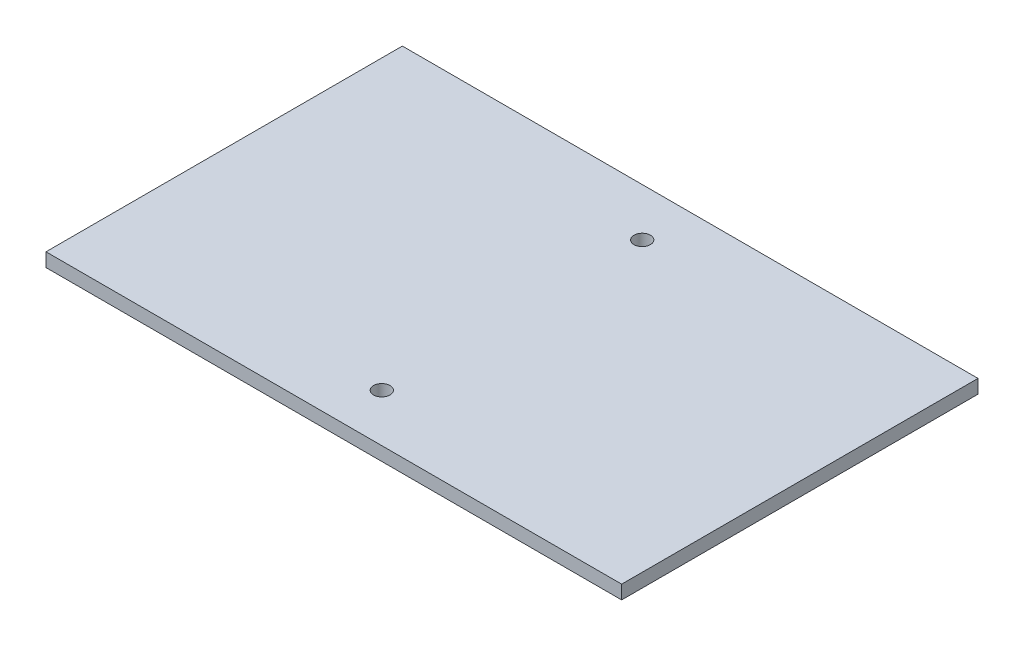
ISO-10303-21;
HEADER;
FILE_DESCRIPTION(('STEP AP214'),'2;1');
FILE_NAME('part.step','',(''),(''),'','','');
FILE_SCHEMA(('AUTOMOTIVE_DESIGN { 1 0 10303 214 1 1 1 1 }'));
ENDSEC;
DATA;
#1=APPLICATION_CONTEXT('core data for automotive mechanical design processes');
#2=APPLICATION_PROTOCOL_DEFINITION('international standard','automotive_design',2000,#1);
#3=PRODUCT_CONTEXT('',#1,'mechanical');
#4=PRODUCT('Part','Part','',(#3));
#5=PRODUCT_RELATED_PRODUCT_CATEGORY('part','',(#4));
#6=PRODUCT_DEFINITION_FORMATION('','',#4);
#7=PRODUCT_DEFINITION_CONTEXT('part definition',#1,'design');
#8=PRODUCT_DEFINITION('design','',#6,#7);
#9=PRODUCT_DEFINITION_SHAPE('','',#8);
#10=(LENGTH_UNIT() NAMED_UNIT(*) SI_UNIT(.MILLI.,.METRE.));
#11=(NAMED_UNIT(*) PLANE_ANGLE_UNIT() SI_UNIT($,.RADIAN.));
#12=(NAMED_UNIT(*) SI_UNIT($,.STERADIAN.) SOLID_ANGLE_UNIT());
#13=UNCERTAINTY_MEASURE_WITH_UNIT(LENGTH_MEASURE(1.E-05),#10,'distance_accuracy_value','');
#14=(GEOMETRIC_REPRESENTATION_CONTEXT(3) GLOBAL_UNCERTAINTY_ASSIGNED_CONTEXT((#13)) GLOBAL_UNIT_ASSIGNED_CONTEXT((#10,
#11,#12)) REPRESENTATION_CONTEXT('',''));
#15=CARTESIAN_POINT('',(0.,0.,0.));
#16=DIRECTION('',(0.,0.,1.));
#17=DIRECTION('',(1.,0.,0.));
#18=AXIS2_PLACEMENT_3D('',#15,#16,#17);
#19=CARTESIAN_POINT('',(105.,5.,-60.));
#20=DIRECTION('',(-1.,0.,0.));
#21=DIRECTION('',(0.,0.,1.));
#22=AXIS2_PLACEMENT_3D('',#19,#20,#21);
#23=PLANE('',#22);
#24=DIRECTION('',(0.,0.,-1.));
#25=VECTOR('',#24,1.);
#26=CARTESIAN_POINT('',(105.,0.,-60.));
#27=LINE('',#26,#25);
#28=CARTESIAN_POINT('',(105.,0.,65.));
#29=VERTEX_POINT('',#28);
#30=CARTESIAN_POINT('',(105.,0.,-65.));
#31=VERTEX_POINT('',#30);
#32=EDGE_CURVE('E83',#29,#31,#27,.T.);
#33=ORIENTED_EDGE('',*,*,#32,.T.);
#34=DIRECTION('',(0.,-1.,0.));
#35=VECTOR('',#34,1.);
#36=CARTESIAN_POINT('',(105.,5.,-65.));
#37=LINE('',#36,#35);
#38=CARTESIAN_POINT('',(105.,5.,-65.));
#39=VERTEX_POINT('',#38);
#40=EDGE_CURVE('E86',#39,#31,#37,.T.);
#41=ORIENTED_EDGE('',*,*,#40,.F.);
#42=DIRECTION('',(0.,0.,-1.));
#43=VECTOR('',#42,1.);
#44=CARTESIAN_POINT('',(105.,5.,-60.));
#45=LINE('',#44,#43);
#46=CARTESIAN_POINT('',(105.,5.,65.));
#47=VERTEX_POINT('',#46);
#48=EDGE_CURVE('E53',#47,#39,#45,.T.);
#49=ORIENTED_EDGE('',*,*,#48,.F.);
#50=DIRECTION('',(0.,1.,0.));
#51=VECTOR('',#50,1.);
#52=CARTESIAN_POINT('',(105.,0.,65.));
#53=LINE('',#52,#51);
#54=EDGE_CURVE('E87',#29,#47,#53,.T.);
#55=ORIENTED_EDGE('',*,*,#54,.F.);
#56=EDGE_LOOP('',(#33,#41,#49,#55));
#57=FACE_BOUND('',#56,.T.);
#58=ADVANCED_FACE('F44',(#57),#23,.F.);
#59=CARTESIAN_POINT('',(-105.,5.,-60.));
#60=DIRECTION('',(1.,0.,0.));
#61=DIRECTION('',(0.,0.,-1.));
#62=AXIS2_PLACEMENT_3D('',#59,#60,#61);
#63=PLANE('',#62);
#64=DIRECTION('',(0.,0.,1.));
#65=VECTOR('',#64,1.);
#66=CARTESIAN_POINT('',(-105.,0.,-60.));
#67=LINE('',#66,#65);
#68=CARTESIAN_POINT('',(-105.,0.,-65.));
#69=VERTEX_POINT('',#68);
#70=CARTESIAN_POINT('',(-105.,0.,65.));
#71=VERTEX_POINT('',#70);
#72=EDGE_CURVE('E92',#69,#71,#67,.T.);
#73=ORIENTED_EDGE('',*,*,#72,.T.);
#74=DIRECTION('',(0.,-1.,0.));
#75=VECTOR('',#74,1.);
#76=CARTESIAN_POINT('',(-105.,5.,65.));
#77=LINE('',#76,#75);
#78=CARTESIAN_POINT('',(-105.,5.,65.));
#79=VERTEX_POINT('',#78);
#80=EDGE_CURVE('E115',#79,#71,#77,.T.);
#81=ORIENTED_EDGE('',*,*,#80,.F.);
#82=DIRECTION('',(0.,0.,1.));
#83=VECTOR('',#82,1.);
#84=CARTESIAN_POINT('',(-105.,5.,-60.));
#85=LINE('',#84,#83);
#86=CARTESIAN_POINT('',(-105.,5.,-65.));
#87=VERTEX_POINT('',#86);
#88=EDGE_CURVE('E11',#87,#79,#85,.T.);
#89=ORIENTED_EDGE('',*,*,#88,.F.);
#90=DIRECTION('',(0.,1.,0.));
#91=VECTOR('',#90,1.);
#92=CARTESIAN_POINT('',(-105.,0.,-65.));
#93=LINE('',#92,#91);
#94=EDGE_CURVE('E101',#69,#87,#93,.T.);
#95=ORIENTED_EDGE('',*,*,#94,.F.);
#96=EDGE_LOOP('',(#73,#81,#89,#95));
#97=FACE_BOUND('',#96,.T.);
#98=ADVANCED_FACE('F161',(#97),#63,.F.);
#99=CARTESIAN_POINT('',(0.,5.,0.));
#100=DIRECTION('',(0.,1.,0.));
#101=DIRECTION('',(0.,0.,1.));
#102=AXIS2_PLACEMENT_3D('',#99,#100,#101);
#103=PLANE('',#102);
#104=CARTESIAN_POINT('',(0.,5.,-47.5));
#105=DIRECTION('',(0.,1.,0.));
#106=DIRECTION('',(0.,0.,1.));
#107=AXIS2_PLACEMENT_3D('',#104,#105,#106);
#108=CIRCLE('',#107,3.);
#109=CARTESIAN_POINT('',(0.,5.,-44.5));
#110=VERTEX_POINT('',#109);
#111=EDGE_CURVE('E128',#110,#110,#108,.T.);
#112=ORIENTED_EDGE('',*,*,#111,.F.);
#113=EDGE_LOOP('',(#112));
#114=FACE_BOUND('',#113,.T.);
#115=CARTESIAN_POINT('',(0.,5.,47.5));
#116=DIRECTION('',(0.,1.,0.));
#117=DIRECTION('',(0.,0.,1.));
#118=AXIS2_PLACEMENT_3D('',#115,#116,#117);
#119=CIRCLE('',#118,3.);
#120=CARTESIAN_POINT('',(0.,5.,50.5));
#121=VERTEX_POINT('',#120);
#122=EDGE_CURVE('E127',#121,#121,#119,.T.);
#123=ORIENTED_EDGE('',*,*,#122,.F.);
#124=EDGE_LOOP('',(#123));
#125=FACE_BOUND('',#124,.T.);
#126=ORIENTED_EDGE('',*,*,#48,.T.);
#127=DIRECTION('',(1.,0.,0.));
#128=VECTOR('',#127,1.);
#129=CARTESIAN_POINT('',(-105.,5.,-65.));
#130=LINE('',#129,#128);
#131=EDGE_CURVE('E105',#87,#39,#130,.T.);
#132=ORIENTED_EDGE('',*,*,#131,.F.);
#133=ORIENTED_EDGE('',*,*,#88,.T.);
#134=DIRECTION('',(-1.,0.,0.));
#135=VECTOR('',#134,1.);
#136=CARTESIAN_POINT('',(105.,5.,65.));
#137=LINE('',#136,#135);
#138=EDGE_CURVE('E124',#47,#79,#137,.T.);
#139=ORIENTED_EDGE('',*,*,#138,.F.);
#140=EDGE_LOOP('',(#126,#132,#133,#139));
#141=FACE_BOUND('',#140,.T.);
#142=ADVANCED_FACE('F165',(#114,#125,#141),#103,.T.);
#143=CARTESIAN_POINT('',(0.,0.,0.));
#144=DIRECTION('',(0.,1.,0.));
#145=DIRECTION('',(0.,0.,1.));
#146=AXIS2_PLACEMENT_3D('',#143,#144,#145);
#147=PLANE('',#146);
#148=CARTESIAN_POINT('',(0.,0.,-47.5));
#149=DIRECTION('',(0.,1.,0.));
#150=DIRECTION('',(0.,0.,1.));
#151=AXIS2_PLACEMENT_3D('',#148,#149,#150);
#152=CIRCLE('',#151,3.);
#153=CARTESIAN_POINT('',(0.,0.,-44.5));
#154=VERTEX_POINT('',#153);
#155=EDGE_CURVE('E47',#154,#154,#152,.T.);
#156=ORIENTED_EDGE('',*,*,#155,.T.);
#157=EDGE_LOOP('',(#156));
#158=FACE_BOUND('',#157,.T.);
#159=CARTESIAN_POINT('',(0.,0.,47.5));
#160=DIRECTION('',(0.,1.,0.));
#161=DIRECTION('',(0.,0.,1.));
#162=AXIS2_PLACEMENT_3D('',#159,#160,#161);
#163=CIRCLE('',#162,3.);
#164=CARTESIAN_POINT('',(0.,0.,50.5));
#165=VERTEX_POINT('',#164);
#166=EDGE_CURVE('E131',#165,#165,#163,.T.);
#167=ORIENTED_EDGE('',*,*,#166,.T.);
#168=EDGE_LOOP('',(#167));
#169=FACE_BOUND('',#168,.T.);
#170=ORIENTED_EDGE('',*,*,#32,.F.);
#171=DIRECTION('',(1.,0.,0.));
#172=VECTOR('',#171,1.);
#173=CARTESIAN_POINT('',(-105.,0.,65.));
#174=LINE('',#173,#172);
#175=EDGE_CURVE('E119',#71,#29,#174,.T.);
#176=ORIENTED_EDGE('',*,*,#175,.F.);
#177=ORIENTED_EDGE('',*,*,#72,.F.);
#178=DIRECTION('',(-1.,0.,0.));
#179=VECTOR('',#178,1.);
#180=CARTESIAN_POINT('',(105.,0.,-65.));
#181=LINE('',#180,#179);
#182=EDGE_CURVE('E95',#31,#69,#181,.T.);
#183=ORIENTED_EDGE('',*,*,#182,.F.);
#184=EDGE_LOOP('',(#170,#176,#177,#183));
#185=FACE_BOUND('',#184,.T.);
#186=ADVANCED_FACE('F96',(#158,#169,#185),#147,.F.);
#187=CARTESIAN_POINT('',(0.,-5.,47.5));
#188=DIRECTION('',(0.,1.,0.));
#189=DIRECTION('',(0.,0.,1.));
#190=AXIS2_PLACEMENT_3D('',#187,#188,#189);
#191=CYLINDRICAL_SURFACE('',#190,3.);
#192=ORIENTED_EDGE('',*,*,#122,.T.);
#193=EDGE_LOOP('',(#192));
#194=FACE_BOUND('',#193,.T.);
#195=ORIENTED_EDGE('',*,*,#166,.F.);
#196=EDGE_LOOP('',(#195));
#197=FACE_BOUND('',#196,.T.);
#198=ADVANCED_FACE('F149',(#194,#197),#191,.F.);
#199=CARTESIAN_POINT('',(0.,-5.,-47.5));
#200=DIRECTION('',(0.,1.,0.));
#201=DIRECTION('',(0.,0.,1.));
#202=AXIS2_PLACEMENT_3D('',#199,#200,#201);
#203=CYLINDRICAL_SURFACE('',#202,3.);
#204=ORIENTED_EDGE('',*,*,#111,.T.);
#205=EDGE_LOOP('',(#204));
#206=FACE_BOUND('',#205,.T.);
#207=ORIENTED_EDGE('',*,*,#155,.F.);
#208=EDGE_LOOP('',(#207));
#209=FACE_BOUND('',#208,.T.);
#210=ADVANCED_FACE('F146',(#206,#209),#203,.F.);
#211=CARTESIAN_POINT('',(0.,0.,65.));
#212=DIRECTION('',(0.,0.,1.));
#213=DIRECTION('',(1.,0.,0.));
#214=AXIS2_PLACEMENT_3D('',#211,#212,#213);
#215=PLANE('',#214);
#216=ORIENTED_EDGE('',*,*,#80,.T.);
#217=ORIENTED_EDGE('',*,*,#175,.T.);
#218=ORIENTED_EDGE('',*,*,#54,.T.);
#219=ORIENTED_EDGE('',*,*,#138,.T.);
#220=EDGE_LOOP('',(#216,#217,#218,#219));
#221=FACE_BOUND('',#220,.T.);
#222=ADVANCED_FACE('F148',(#221),#215,.T.);
#223=CARTESIAN_POINT('',(0.,0.,-65.));
#224=DIRECTION('',(0.,0.,-1.));
#225=DIRECTION('',(-1.,0.,0.));
#226=AXIS2_PLACEMENT_3D('',#223,#224,#225);
#227=PLANE('',#226);
#228=ORIENTED_EDGE('',*,*,#40,.T.);
#229=ORIENTED_EDGE('',*,*,#182,.T.);
#230=ORIENTED_EDGE('',*,*,#94,.T.);
#231=ORIENTED_EDGE('',*,*,#131,.T.);
#232=EDGE_LOOP('',(#228,#229,#230,#231));
#233=FACE_BOUND('',#232,.T.);
#234=ADVANCED_FACE('F104',(#233),#227,.T.);
#235=CLOSED_SHELL('',(#58,#98,#142,#186,#198,#210,#222,#234));
#236=MANIFOLD_SOLID_BREP('B2',#235);
#237=ADVANCED_BREP_SHAPE_REPRESENTATION('',(#18,#236),#14);
#238=SHAPE_DEFINITION_REPRESENTATION(#9,#237);
ENDSEC;
END-ISO-10303-21;
